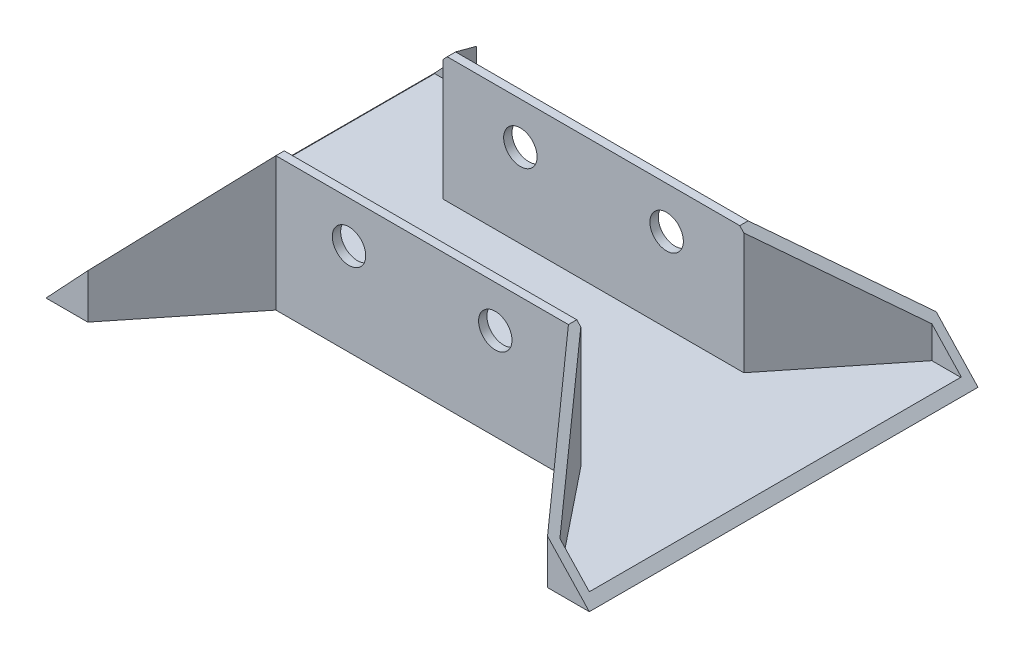
ISO-10303-21;
HEADER;
FILE_DESCRIPTION(('STEP AP214'),'2;1');
FILE_NAME('part.step','',(''),(''),'','','');
FILE_SCHEMA(('AUTOMOTIVE_DESIGN { 1 0 10303 214 1 1 1 1 }'));
ENDSEC;
DATA;
#1=APPLICATION_CONTEXT('core data for automotive mechanical design processes');
#2=APPLICATION_PROTOCOL_DEFINITION('international standard','automotive_design',2000,#1);
#3=PRODUCT_CONTEXT('',#1,'mechanical');
#4=PRODUCT('Part','Part','',(#3));
#5=PRODUCT_RELATED_PRODUCT_CATEGORY('part','',(#4));
#6=PRODUCT_DEFINITION_FORMATION('','',#4);
#7=PRODUCT_DEFINITION_CONTEXT('part definition',#1,'design');
#8=PRODUCT_DEFINITION('design','',#6,#7);
#9=PRODUCT_DEFINITION_SHAPE('','',#8);
#10=(LENGTH_UNIT() NAMED_UNIT(*) SI_UNIT(.MILLI.,.METRE.));
#11=(NAMED_UNIT(*) PLANE_ANGLE_UNIT() SI_UNIT($,.RADIAN.));
#12=(NAMED_UNIT(*) SI_UNIT($,.STERADIAN.) SOLID_ANGLE_UNIT());
#13=UNCERTAINTY_MEASURE_WITH_UNIT(LENGTH_MEASURE(1.E-05),#10,'distance_accuracy_value','');
#14=(GEOMETRIC_REPRESENTATION_CONTEXT(3) GLOBAL_UNCERTAINTY_ASSIGNED_CONTEXT((#13)) GLOBAL_UNIT_ASSIGNED_CONTEXT((#10,
#11,#12)) REPRESENTATION_CONTEXT('',''));
#15=CARTESIAN_POINT('',(0.,0.,0.));
#16=DIRECTION('',(0.,0.,1.));
#17=DIRECTION('',(1.,0.,0.));
#18=AXIS2_PLACEMENT_3D('',#15,#16,#17);
#19=CARTESIAN_POINT('',(35.,32.,46.5));
#20=DIRECTION('',(0.,-1.,0.));
#21=DIRECTION('',(1.,0.,0.));
#22=AXIS2_PLACEMENT_3D('',#19,#20,#21);
#23=PLANE('',#22);
#24=DIRECTION('',(0.,0.,-1.));
#25=VECTOR('',#24,1.);
#26=CARTESIAN_POINT('',(-35.,32.,46.5));
#27=LINE('',#26,#25);
#28=CARTESIAN_POINT('',(-35.,32.,-19.5));
#29=VERTEX_POINT('',#28);
#30=CARTESIAN_POINT('',(-35.,32.,-21.5));
#31=VERTEX_POINT('',#30);
#32=EDGE_CURVE('E303',#29,#31,#27,.T.);
#33=ORIENTED_EDGE('',*,*,#32,.F.);
#34=DIRECTION('',(1.,0.,0.));
#35=VECTOR('',#34,1.);
#36=CARTESIAN_POINT('',(35.,32.,-19.5));
#37=LINE('',#36,#35);
#38=CARTESIAN_POINT('',(35.,32.,-19.5));
#39=VERTEX_POINT('',#38);
#40=EDGE_CURVE('E326',#29,#39,#37,.T.);
#41=ORIENTED_EDGE('',*,*,#40,.T.);
#42=DIRECTION('',(0.,0.,-1.));
#43=VECTOR('',#42,1.);
#44=CARTESIAN_POINT('',(35.,32.,46.5));
#45=LINE('',#44,#43);
#46=CARTESIAN_POINT('',(35.,32.,-21.5));
#47=VERTEX_POINT('',#46);
#48=EDGE_CURVE('E314',#39,#47,#45,.T.);
#49=ORIENTED_EDGE('',*,*,#48,.T.);
#50=DIRECTION('',(1.,0.,0.));
#51=VECTOR('',#50,1.);
#52=CARTESIAN_POINT('',(-35.,32.,-21.5));
#53=LINE('',#52,#51);
#54=EDGE_CURVE('E237',#31,#47,#53,.T.);
#55=ORIENTED_EDGE('',*,*,#54,.F.);
#56=EDGE_LOOP('',(#33,#41,#49,#55));
#57=FACE_BOUND('',#56,.T.);
#58=ADVANCED_FACE('F35',(#57),#23,.F.);
#59=CARTESIAN_POINT('',(0.,0.,46.5));
#60=DIRECTION('',(0.,0.,-1.));
#61=DIRECTION('',(-1.,0.,0.));
#62=AXIS2_PLACEMENT_3D('',#59,#60,#61);
#63=PLANE('',#62);
#64=DIRECTION('',(1.,0.,0.));
#65=VECTOR('',#64,1.);
#66=CARTESIAN_POINT('',(-65.,0.,46.5));
#67=LINE('',#66,#65);
#68=CARTESIAN_POINT('',(-65.,0.,46.5));
#69=VERTEX_POINT('',#68);
#70=CARTESIAN_POINT('',(-55.,0.,46.5));
#71=VERTEX_POINT('',#70);
#72=EDGE_CURVE('E297',#69,#71,#67,.T.);
#73=ORIENTED_EDGE('',*,*,#72,.T.);
#74=DIRECTION('',(0.,1.,0.));
#75=VECTOR('',#74,1.);
#76=CARTESIAN_POINT('',(-55.,0.,46.5));
#77=LINE('',#76,#75);
#78=CARTESIAN_POINT('',(-55.,10.6666666666667,46.5));
#79=VERTEX_POINT('',#78);
#80=EDGE_CURVE('E250',#71,#79,#77,.T.);
#81=ORIENTED_EDGE('',*,*,#80,.T.);
#82=DIRECTION('',(-0.68394112888133,-0.729537204140085,0.));
#83=VECTOR('',#82,1.);
#84=CARTESIAN_POINT('',(-35.,32.,46.5));
#85=LINE('',#84,#83);
#86=EDGE_CURVE('E293',#79,#69,#85,.T.);
#87=ORIENTED_EDGE('',*,*,#86,.T.);
#88=EDGE_LOOP('',(#73,#81,#87));
#89=FACE_BOUND('',#88,.T.);
#90=ADVANCED_FACE('F468',(#89),#63,.F.);
#91=CARTESIAN_POINT('',(0.,0.,-46.5));
#92=DIRECTION('',(0.,0.,-1.));
#93=DIRECTION('',(-1.,0.,0.));
#94=AXIS2_PLACEMENT_3D('',#91,#92,#93);
#95=PLANE('',#94);
#96=DIRECTION('',(0.,1.,0.));
#97=VECTOR('',#96,1.);
#98=CARTESIAN_POINT('',(55.,0.,-46.5));
#99=LINE('',#98,#97);
#100=CARTESIAN_POINT('',(55.,0.,-46.5));
#101=VERTEX_POINT('',#100);
#102=CARTESIAN_POINT('',(55.,10.6666666666667,-46.5));
#103=VERTEX_POINT('',#102);
#104=EDGE_CURVE('E249',#101,#103,#99,.T.);
#105=ORIENTED_EDGE('',*,*,#104,.T.);
#106=DIRECTION('',(-0.68394112888133,0.729537204140085,0.));
#107=VECTOR('',#106,1.);
#108=CARTESIAN_POINT('',(65.,0.,-46.5));
#109=LINE('',#108,#107);
#110=CARTESIAN_POINT('',(65.,0.,-46.5));
#111=VERTEX_POINT('',#110);
#112=EDGE_CURVE('E296',#111,#103,#109,.T.);
#113=ORIENTED_EDGE('',*,*,#112,.F.);
#114=DIRECTION('',(1.,0.,0.));
#115=VECTOR('',#114,1.);
#116=CARTESIAN_POINT('',(-65.,0.,-46.5));
#117=LINE('',#116,#115);
#118=EDGE_CURVE('E305',#101,#111,#117,.T.);
#119=ORIENTED_EDGE('',*,*,#118,.F.);
#120=EDGE_LOOP('',(#105,#113,#119));
#121=FACE_BOUND('',#120,.T.);
#122=ADVANCED_FACE('F487',(#121),#95,.T.);
#123=CARTESIAN_POINT('',(-35.,32.,46.5));
#124=DIRECTION('',(0.729537204140085,-0.68394112888133,0.));
#125=DIRECTION('',(0.68394112888133,0.729537204140085,0.));
#126=AXIS2_PLACEMENT_3D('',#123,#124,#125);
#127=PLANE('',#126);
#128=DIRECTION('',(0.519855731172255,0.554512779917072,0.64981966396532));
#129=VECTOR('',#128,1.);
#130=CARTESIAN_POINT('',(-13.1102792233484,55.349035495095,9.06371308953099));
#131=LINE('',#130,#129);
#132=CARTESIAN_POINT('',(-55.9612496949732,9.64133365869531,-44.5));
#133=VERTEX_POINT('',#132);
#134=CARTESIAN_POINT('',(-35.9612496949732,30.9746669920286,-19.5));
#135=VERTEX_POINT('',#134);
#136=EDGE_CURVE('E12',#133,#135,#131,.T.);
#137=ORIENTED_EDGE('',*,*,#136,.T.);
#138=DIRECTION('',(0.68394112888133,0.729537204140085,0.));
#139=VECTOR('',#138,1.);
#140=CARTESIAN_POINT('',(-35.,32.,-19.5));
#141=LINE('',#140,#139);
#142=EDGE_CURVE('E234',#135,#29,#141,.T.);
#143=ORIENTED_EDGE('',*,*,#142,.T.);
#144=ORIENTED_EDGE('',*,*,#32,.T.);
#145=DIRECTION('',(-0.519855731172255,-0.554512779917072,-0.649819663965319));
#146=VECTOR('',#145,1.);
#147=CARTESIAN_POINT('',(-12.0287515952256,56.5026649650927,7.21406050596806));
#148=LINE('',#147,#146);
#149=CARTESIAN_POINT('',(-55.,10.6666666666666,-46.5));
#150=VERTEX_POINT('',#149);
#151=EDGE_CURVE('E253',#31,#150,#148,.T.);
#152=ORIENTED_EDGE('',*,*,#151,.T.);
#153=DIRECTION('',(-0.68394112888133,-0.729537204140085,0.));
#154=VECTOR('',#153,1.);
#155=CARTESIAN_POINT('',(-35.,32.,-46.5));
#156=LINE('',#155,#154);
#157=CARTESIAN_POINT('',(-65.,0.,-46.5));
#158=VERTEX_POINT('',#157);
#159=EDGE_CURVE('E292',#150,#158,#156,.T.);
#160=ORIENTED_EDGE('',*,*,#159,.T.);
#161=DIRECTION('',(0.,0.,-1.));
#162=VECTOR('',#161,1.);
#163=CARTESIAN_POINT('',(-65.,0.,46.5));
#164=LINE('',#163,#162);
#165=EDGE_CURVE('E321',#69,#158,#164,.T.);
#166=ORIENTED_EDGE('',*,*,#165,.F.);
#167=ORIENTED_EDGE('',*,*,#86,.F.);
#168=DIRECTION('',(0.519855731172255,0.554512779917072,-0.649819663965319));
#169=VECTOR('',#168,1.);
#170=CARTESIAN_POINT('',(-43.44531191352,22.9916672922453,32.0566398919));
#171=LINE('',#170,#169);
#172=CARTESIAN_POINT('',(-35.,32.,21.5));
#173=VERTEX_POINT('',#172);
#174=EDGE_CURVE('E289',#79,#173,#171,.T.);
#175=ORIENTED_EDGE('',*,*,#174,.T.);
#176=CARTESIAN_POINT('',(-35.,32.,19.5));
#177=VERTEX_POINT('',#176);
#178=EDGE_CURVE('E311',#173,#177,#27,.T.);
#179=ORIENTED_EDGE('',*,*,#178,.T.);
#180=DIRECTION('',(-0.68394112888133,-0.729537204140085,0.));
#181=VECTOR('',#180,1.);
#182=CARTESIAN_POINT('',(-35.,32.,19.5));
#183=LINE('',#182,#181);
#184=CARTESIAN_POINT('',(-35.9612496949732,30.9746669920286,19.5));
#185=VERTEX_POINT('',#184);
#186=EDGE_CURVE('E52',#177,#185,#183,.T.);
#187=ORIENTED_EDGE('',*,*,#186,.T.);
#188=DIRECTION('',(-0.519855731172256,-0.554512779917072,0.649819663965319));
#189=VECTOR('',#188,1.);
#190=CARTESIAN_POINT('',(-44.5268395416428,21.8380378222477,30.2069873083371));
#191=LINE('',#190,#189);
#192=CARTESIAN_POINT('',(-55.9612496949732,9.6413336586953,44.5));
#193=VERTEX_POINT('',#192);
#194=EDGE_CURVE('E343',#185,#193,#191,.T.);
#195=ORIENTED_EDGE('',*,*,#194,.T.);
#196=DIRECTION('',(-0.68394112888133,-0.729537204140085,0.));
#197=VECTOR('',#196,1.);
#198=CARTESIAN_POINT('',(-35.,32.,44.5));
#199=LINE('',#198,#197);
#200=CARTESIAN_POINT('',(-63.,2.13333333333335,44.5));
#201=VERTEX_POINT('',#200);
#202=EDGE_CURVE('E346',#193,#201,#199,.T.);
#203=ORIENTED_EDGE('',*,*,#202,.T.);
#204=DIRECTION('',(0.,0.,-1.));
#205=VECTOR('',#204,1.);
#206=CARTESIAN_POINT('',(-63.,2.13333333333333,46.5));
#207=LINE('',#206,#205);
#208=CARTESIAN_POINT('',(-63.,2.1333333333333,-44.5));
#209=VERTEX_POINT('',#208);
#210=EDGE_CURVE('E349',#201,#209,#207,.T.);
#211=ORIENTED_EDGE('',*,*,#210,.T.);
#212=DIRECTION('',(0.68394112888133,0.729537204140085,0.));
#213=VECTOR('',#212,1.);
#214=CARTESIAN_POINT('',(-35.,32.,-44.5));
#215=LINE('',#214,#213);
#216=EDGE_CURVE('E44',#209,#133,#215,.T.);
#217=ORIENTED_EDGE('',*,*,#216,.T.);
#218=EDGE_LOOP('',(#137,#143,#144,#152,#160,#166,#167,#175,#179,#187,#195,#203,#211,#217));
#219=FACE_BOUND('',#218,.T.);
#220=ADVANCED_FACE('F37',(#219),#127,.F.);
#221=CARTESIAN_POINT('',(-65.,0.,46.5));
#222=DIRECTION('',(0.,1.,0.));
#223=DIRECTION('',(-1.,0.,0.));
#224=AXIS2_PLACEMENT_3D('',#221,#222,#223);
#225=PLANE('',#224);
#226=DIRECTION('',(-1.,0.,0.));
#227=VECTOR('',#226,1.);
#228=CARTESIAN_POINT('',(-35.,0.,21.5));
#229=LINE('',#228,#227);
#230=CARTESIAN_POINT('',(35.,0.,21.5));
#231=VERTEX_POINT('',#230);
#232=CARTESIAN_POINT('',(-35.,0.,21.5));
#233=VERTEX_POINT('',#232);
#234=EDGE_CURVE('E239',#231,#233,#229,.T.);
#235=ORIENTED_EDGE('',*,*,#234,.T.);
#236=DIRECTION('',(-0.624695047554425,0.,0.78086880944303));
#237=VECTOR('',#236,1.);
#238=CARTESIAN_POINT('',(-55.,0.,46.5));
#239=LINE('',#238,#237);
#240=EDGE_CURVE('E243',#233,#71,#239,.T.);
#241=ORIENTED_EDGE('',*,*,#240,.T.);
#242=ORIENTED_EDGE('',*,*,#72,.F.);
#243=ORIENTED_EDGE('',*,*,#165,.T.);
#244=CARTESIAN_POINT('',(-55.,0.,-46.5));
#245=VERTEX_POINT('',#244);
#246=EDGE_CURVE('E306',#158,#245,#117,.T.);
#247=ORIENTED_EDGE('',*,*,#246,.T.);
#248=DIRECTION('',(0.624695047554424,0.,0.78086880944303));
#249=VECTOR('',#248,1.);
#250=CARTESIAN_POINT('',(-55.,0.,-46.5));
#251=LINE('',#250,#249);
#252=CARTESIAN_POINT('',(-35.,0.,-21.5));
#253=VERTEX_POINT('',#252);
#254=EDGE_CURVE('E260',#245,#253,#251,.T.);
#255=ORIENTED_EDGE('',*,*,#254,.T.);
#256=DIRECTION('',(1.,0.,0.));
#257=VECTOR('',#256,1.);
#258=CARTESIAN_POINT('',(-35.,0.,-21.5));
#259=LINE('',#258,#257);
#260=CARTESIAN_POINT('',(35.,0.,-21.5));
#261=VERTEX_POINT('',#260);
#262=EDGE_CURVE('E263',#253,#261,#259,.T.);
#263=ORIENTED_EDGE('',*,*,#262,.T.);
#264=DIRECTION('',(0.624695047554424,0.,-0.780868809443031));
#265=VECTOR('',#264,1.);
#266=CARTESIAN_POINT('',(35.,0.,-21.5));
#267=LINE('',#266,#265);
#268=EDGE_CURVE('E266',#261,#101,#267,.T.);
#269=ORIENTED_EDGE('',*,*,#268,.T.);
#270=ORIENTED_EDGE('',*,*,#118,.T.);
#271=DIRECTION('',(0.,0.,-1.));
#272=VECTOR('',#271,1.);
#273=CARTESIAN_POINT('',(65.,0.,46.5));
#274=LINE('',#273,#272);
#275=CARTESIAN_POINT('',(65.,0.,46.5));
#276=VERTEX_POINT('',#275);
#277=EDGE_CURVE('E318',#276,#111,#274,.T.);
#278=ORIENTED_EDGE('',*,*,#277,.F.);
#279=CARTESIAN_POINT('',(55.,0.,46.5));
#280=VERTEX_POINT('',#279);
#281=EDGE_CURVE('E295',#280,#276,#67,.T.);
#282=ORIENTED_EDGE('',*,*,#281,.F.);
#283=DIRECTION('',(-0.624695047554424,0.,-0.78086880944303));
#284=VECTOR('',#283,1.);
#285=CARTESIAN_POINT('',(35.,0.,21.5));
#286=LINE('',#285,#284);
#287=EDGE_CURVE('E60',#280,#231,#286,.T.);
#288=ORIENTED_EDGE('',*,*,#287,.T.);
#289=EDGE_LOOP('',(#235,#241,#242,#243,#247,#255,#263,#269,#270,#278,#282,#288));
#290=FACE_BOUND('',#289,.T.);
#291=ADVANCED_FACE('F464',(#290),#225,.F.);
#292=CARTESIAN_POINT('',(65.,0.,46.5));
#293=DIRECTION('',(-0.729537204140085,-0.68394112888133,0.));
#294=DIRECTION('',(0.68394112888133,-0.729537204140085,0.));
#295=AXIS2_PLACEMENT_3D('',#292,#293,#294);
#296=PLANE('',#295);
#297=ORIENTED_EDGE('',*,*,#48,.F.);
#298=DIRECTION('',(0.68394112888133,-0.729537204140085,0.));
#299=VECTOR('',#298,1.);
#300=CARTESIAN_POINT('',(65.,0.,-19.5));
#301=LINE('',#300,#299);
#302=CARTESIAN_POINT('',(35.9612496949731,30.9746669920286,-19.5));
#303=VERTEX_POINT('',#302);
#304=EDGE_CURVE('E231',#39,#303,#301,.T.);
#305=ORIENTED_EDGE('',*,*,#304,.T.);
#306=DIRECTION('',(0.519855731172255,-0.554512779917072,-0.64981966396532));
#307=VECTOR('',#306,1.);
#308=CARTESIAN_POINT('',(30.4423113530684,36.8615345567271,-12.601327072619));
#309=LINE('',#308,#307);
#310=CARTESIAN_POINT('',(55.9612496949731,9.64133365869531,-44.5));
#311=VERTEX_POINT('',#310);
#312=EDGE_CURVE('E340',#303,#311,#309,.T.);
#313=ORIENTED_EDGE('',*,*,#312,.T.);
#314=DIRECTION('',(0.68394112888133,-0.729537204140085,0.));
#315=VECTOR('',#314,1.);
#316=CARTESIAN_POINT('',(65.,0.,-44.5));
#317=LINE('',#316,#315);
#318=CARTESIAN_POINT('',(63.,2.13333333333335,-44.5));
#319=VERTEX_POINT('',#318);
#320=EDGE_CURVE('E337',#311,#319,#317,.T.);
#321=ORIENTED_EDGE('',*,*,#320,.T.);
#322=DIRECTION('',(0.,0.,1.));
#323=VECTOR('',#322,1.);
#324=CARTESIAN_POINT('',(63.,2.13333333333336,46.5));
#325=LINE('',#324,#323);
#326=CARTESIAN_POINT('',(63.,2.13333333333333,44.5));
#327=VERTEX_POINT('',#326);
#328=EDGE_CURVE('E334',#319,#327,#325,.T.);
#329=ORIENTED_EDGE('',*,*,#328,.T.);
#330=DIRECTION('',(-0.68394112888133,0.729537204140085,0.));
#331=VECTOR('',#330,1.);
#332=CARTESIAN_POINT('',(65.,0.,44.5));
#333=LINE('',#332,#331);
#334=CARTESIAN_POINT('',(55.9612496949731,9.64133365869536,44.5));
#335=VERTEX_POINT('',#334);
#336=EDGE_CURVE('E331',#327,#335,#333,.T.);
#337=ORIENTED_EDGE('',*,*,#336,.T.);
#338=DIRECTION('',(-0.519855731172255,0.554512779917072,-0.649819663965319));
#339=VECTOR('',#338,1.);
#340=CARTESIAN_POINT('',(61.8588716713628,3.3505368838797,51.8720274704871));
#341=LINE('',#340,#339);
#342=CARTESIAN_POINT('',(35.9612496949731,30.9746669920286,19.5));
#343=VERTEX_POINT('',#342);
#344=EDGE_CURVE('E329',#335,#343,#341,.T.);
#345=ORIENTED_EDGE('',*,*,#344,.T.);
#346=DIRECTION('',(-0.68394112888133,0.729537204140085,0.));
#347=VECTOR('',#346,1.);
#348=CARTESIAN_POINT('',(65.,0.,19.5));
#349=LINE('',#348,#347);
#350=CARTESIAN_POINT('',(35.,32.,19.5));
#351=VERTEX_POINT('',#350);
#352=EDGE_CURVE('E217',#343,#351,#349,.T.);
#353=ORIENTED_EDGE('',*,*,#352,.T.);
#354=CARTESIAN_POINT('',(35.,32.,21.5));
#355=VERTEX_POINT('',#354);
#356=EDGE_CURVE('E315',#355,#351,#45,.T.);
#357=ORIENTED_EDGE('',*,*,#356,.F.);
#358=DIRECTION('',(0.519855731172255,-0.554512779917072,0.649819663965319));
#359=VECTOR('',#358,1.);
#360=CARTESIAN_POINT('',(60.77734404324,4.50416635387736,53.72168005405));
#361=LINE('',#360,#359);
#362=CARTESIAN_POINT('',(55.,10.6666666666667,46.5));
#363=VERTEX_POINT('',#362);
#364=EDGE_CURVE('E286',#355,#363,#361,.T.);
#365=ORIENTED_EDGE('',*,*,#364,.T.);
#366=DIRECTION('',(-0.68394112888133,0.729537204140085,0.));
#367=VECTOR('',#366,1.);
#368=CARTESIAN_POINT('',(65.,0.,46.5));
#369=LINE('',#368,#367);
#370=EDGE_CURVE('E300',#276,#363,#369,.T.);
#371=ORIENTED_EDGE('',*,*,#370,.F.);
#372=ORIENTED_EDGE('',*,*,#277,.T.);
#373=ORIENTED_EDGE('',*,*,#112,.T.);
#374=DIRECTION('',(-0.519855731172255,0.554512779917072,0.64981966396532));
#375=VECTOR('',#374,1.);
#376=CARTESIAN_POINT('',(29.3607837249455,38.0151640267248,-14.4509796561819));
#377=LINE('',#376,#375);
#378=EDGE_CURVE('E283',#103,#47,#377,.T.);
#379=ORIENTED_EDGE('',*,*,#378,.T.);
#380=EDGE_LOOP('',(#297,#305,#313,#321,#329,#337,#345,#353,#357,#365,#371,#372,#373,#379));
#381=FACE_BOUND('',#380,.T.);
#382=ADVANCED_FACE('F425',(#381),#296,.F.);
#383=ORIENTED_EDGE('',*,*,#356,.T.);
#384=DIRECTION('',(-1.,0.,0.));
#385=VECTOR('',#384,1.);
#386=CARTESIAN_POINT('',(35.,32.,19.5));
#387=LINE('',#386,#385);
#388=EDGE_CURVE('E324',#351,#177,#387,.T.);
#389=ORIENTED_EDGE('',*,*,#388,.T.);
#390=ORIENTED_EDGE('',*,*,#178,.F.);
#391=DIRECTION('',(-1.,0.,0.));
#392=VECTOR('',#391,1.);
#393=CARTESIAN_POINT('',(-35.,32.,21.5));
#394=LINE('',#393,#392);
#395=EDGE_CURVE('E240',#355,#173,#394,.T.);
#396=ORIENTED_EDGE('',*,*,#395,.F.);
#397=EDGE_LOOP('',(#383,#389,#390,#396));
#398=FACE_BOUND('',#397,.T.);
#399=ADVANCED_FACE('F479',(#398),#23,.F.);
#400=ORIENTED_EDGE('',*,*,#370,.T.);
#401=DIRECTION('',(0.,1.,0.));
#402=VECTOR('',#401,1.);
#403=CARTESIAN_POINT('',(55.,0.,46.5));
#404=LINE('',#403,#402);
#405=EDGE_CURVE('E246',#280,#363,#404,.T.);
#406=ORIENTED_EDGE('',*,*,#405,.F.);
#407=ORIENTED_EDGE('',*,*,#281,.T.);
#408=EDGE_LOOP('',(#400,#406,#407));
#409=FACE_BOUND('',#408,.T.);
#410=ADVANCED_FACE('F482',(#409),#63,.F.);
#411=DIRECTION('',(0.,1.,0.));
#412=VECTOR('',#411,1.);
#413=CARTESIAN_POINT('',(-55.,0.,-46.5));
#414=LINE('',#413,#412);
#415=EDGE_CURVE('E269',#245,#150,#414,.T.);
#416=ORIENTED_EDGE('',*,*,#415,.F.);
#417=ORIENTED_EDGE('',*,*,#246,.F.);
#418=ORIENTED_EDGE('',*,*,#159,.F.);
#419=EDGE_LOOP('',(#416,#417,#418));
#420=FACE_BOUND('',#419,.T.);
#421=ADVANCED_FACE('F461',(#420),#95,.T.);
#422=CARTESIAN_POINT('',(35.,0.,-21.5));
#423=DIRECTION('',(0.780868809443031,0.,0.624695047554424));
#424=DIRECTION('',(0.624695047554424,0.,-0.780868809443031));
#425=AXIS2_PLACEMENT_3D('',#422,#423,#424);
#426=PLANE('',#425);
#427=ORIENTED_EDGE('',*,*,#104,.F.);
#428=ORIENTED_EDGE('',*,*,#268,.F.);
#429=DIRECTION('',(0.,1.,0.));
#430=VECTOR('',#429,1.);
#431=CARTESIAN_POINT('',(35.,0.,-21.5));
#432=LINE('',#431,#430);
#433=EDGE_CURVE('E274',#261,#47,#432,.T.);
#434=ORIENTED_EDGE('',*,*,#433,.T.);
#435=ORIENTED_EDGE('',*,*,#378,.F.);
#436=EDGE_LOOP('',(#427,#428,#434,#435));
#437=FACE_BOUND('',#436,.T.);
#438=ADVANCED_FACE('F448',(#437),#426,.F.);
#439=CARTESIAN_POINT('',(-55.,0.,-46.5));
#440=DIRECTION('',(-0.780868809443031,0.,0.624695047554424));
#441=DIRECTION('',(0.624695047554424,0.,0.78086880944303));
#442=AXIS2_PLACEMENT_3D('',#439,#440,#441);
#443=PLANE('',#442);
#444=DIRECTION('',(0.,1.,0.));
#445=VECTOR('',#444,1.);
#446=CARTESIAN_POINT('',(-35.,0.,-21.5));
#447=LINE('',#446,#445);
#448=EDGE_CURVE('E277',#253,#31,#447,.T.);
#449=ORIENTED_EDGE('',*,*,#448,.F.);
#450=ORIENTED_EDGE('',*,*,#254,.F.);
#451=ORIENTED_EDGE('',*,*,#415,.T.);
#452=ORIENTED_EDGE('',*,*,#151,.F.);
#453=EDGE_LOOP('',(#449,#450,#451,#452));
#454=FACE_BOUND('',#453,.T.);
#455=ADVANCED_FACE('F454',(#454),#443,.F.);
#456=CARTESIAN_POINT('',(-35.,0.,-21.5));
#457=DIRECTION('',(0.,0.,1.));
#458=DIRECTION('',(1.,0.,0.));
#459=AXIS2_PLACEMENT_3D('',#456,#457,#458);
#460=PLANE('',#459);
#461=CARTESIAN_POINT('',(-17.5,22.,-21.5));
#462=DIRECTION('',(0.,0.,1.));
#463=DIRECTION('',(1.,0.,0.));
#464=AXIS2_PLACEMENT_3D('',#461,#462,#463);
#465=CIRCLE('',#464,4.);
#466=CARTESIAN_POINT('',(-13.5,22.,-21.5));
#467=VERTEX_POINT('',#466);
#468=EDGE_CURVE('E375',#467,#467,#465,.T.);
#469=ORIENTED_EDGE('',*,*,#468,.T.);
#470=EDGE_LOOP('',(#469));
#471=FACE_BOUND('',#470,.T.);
#472=CARTESIAN_POINT('',(17.5,22.,-21.5));
#473=DIRECTION('',(0.,0.,1.));
#474=DIRECTION('',(1.,0.,0.));
#475=AXIS2_PLACEMENT_3D('',#472,#473,#474);
#476=CIRCLE('',#475,4.);
#477=CARTESIAN_POINT('',(21.5,22.,-21.5));
#478=VERTEX_POINT('',#477);
#479=EDGE_CURVE('E360',#478,#478,#476,.T.);
#480=ORIENTED_EDGE('',*,*,#479,.T.);
#481=EDGE_LOOP('',(#480));
#482=FACE_BOUND('',#481,.T.);
#483=ORIENTED_EDGE('',*,*,#54,.T.);
#484=ORIENTED_EDGE('',*,*,#433,.F.);
#485=ORIENTED_EDGE('',*,*,#262,.F.);
#486=ORIENTED_EDGE('',*,*,#448,.T.);
#487=EDGE_LOOP('',(#483,#484,#485,#486));
#488=FACE_BOUND('',#487,.T.);
#489=ADVANCED_FACE('F451',(#471,#482,#488),#460,.F.);
#490=CARTESIAN_POINT('',(-55.,0.,46.5));
#491=DIRECTION('',(-0.78086880944303,0.,-0.624695047554425));
#492=DIRECTION('',(-0.624695047554425,0.,0.78086880944303));
#493=AXIS2_PLACEMENT_3D('',#490,#491,#492);
#494=PLANE('',#493);
#495=ORIENTED_EDGE('',*,*,#80,.F.);
#496=ORIENTED_EDGE('',*,*,#240,.F.);
#497=DIRECTION('',(0.,1.,0.));
#498=VECTOR('',#497,1.);
#499=CARTESIAN_POINT('',(-35.,0.,21.5));
#500=LINE('',#499,#498);
#501=EDGE_CURVE('E254',#233,#173,#500,.T.);
#502=ORIENTED_EDGE('',*,*,#501,.T.);
#503=ORIENTED_EDGE('',*,*,#174,.F.);
#504=EDGE_LOOP('',(#495,#496,#502,#503));
#505=FACE_BOUND('',#504,.T.);
#506=ADVANCED_FACE('F471',(#505),#494,.F.);
#507=CARTESIAN_POINT('',(35.,0.,21.5));
#508=DIRECTION('',(0.78086880944303,0.,-0.624695047554424));
#509=DIRECTION('',(-0.624695047554424,0.,-0.78086880944303));
#510=AXIS2_PLACEMENT_3D('',#507,#508,#509);
#511=PLANE('',#510);
#512=DIRECTION('',(0.,1.,0.));
#513=VECTOR('',#512,1.);
#514=CARTESIAN_POINT('',(35.,0.,21.5));
#515=LINE('',#514,#513);
#516=EDGE_CURVE('E256',#231,#355,#515,.T.);
#517=ORIENTED_EDGE('',*,*,#516,.F.);
#518=ORIENTED_EDGE('',*,*,#287,.F.);
#519=ORIENTED_EDGE('',*,*,#405,.T.);
#520=ORIENTED_EDGE('',*,*,#364,.F.);
#521=EDGE_LOOP('',(#517,#518,#519,#520));
#522=FACE_BOUND('',#521,.T.);
#523=ADVANCED_FACE('F655',(#522),#511,.F.);
#524=CARTESIAN_POINT('',(-35.,0.,21.5));
#525=DIRECTION('',(0.,0.,-1.));
#526=DIRECTION('',(-1.,0.,0.));
#527=AXIS2_PLACEMENT_3D('',#524,#525,#526);
#528=PLANE('',#527);
#529=CARTESIAN_POINT('',(-17.5,22.,21.5));
#530=DIRECTION('',(0.,0.,1.));
#531=DIRECTION('',(1.,0.,0.));
#532=AXIS2_PLACEMENT_3D('',#529,#530,#531);
#533=CIRCLE('',#532,4.);
#534=CARTESIAN_POINT('',(-13.5,22.,21.5));
#535=VERTEX_POINT('',#534);
#536=EDGE_CURVE('E356',#535,#535,#533,.T.);
#537=ORIENTED_EDGE('',*,*,#536,.F.);
#538=EDGE_LOOP('',(#537));
#539=FACE_BOUND('',#538,.T.);
#540=CARTESIAN_POINT('',(17.5,22.,21.5));
#541=DIRECTION('',(0.,0.,1.));
#542=DIRECTION('',(1.,0.,0.));
#543=AXIS2_PLACEMENT_3D('',#540,#541,#542);
#544=CIRCLE('',#543,4.);
#545=CARTESIAN_POINT('',(21.5,22.,21.5));
#546=VERTEX_POINT('',#545);
#547=EDGE_CURVE('E363',#546,#546,#544,.T.);
#548=ORIENTED_EDGE('',*,*,#547,.F.);
#549=EDGE_LOOP('',(#548));
#550=FACE_BOUND('',#549,.T.);
#551=ORIENTED_EDGE('',*,*,#395,.T.);
#552=ORIENTED_EDGE('',*,*,#501,.F.);
#553=ORIENTED_EDGE('',*,*,#234,.F.);
#554=ORIENTED_EDGE('',*,*,#516,.T.);
#555=EDGE_LOOP('',(#551,#552,#553,#554));
#556=FACE_BOUND('',#555,.T.);
#557=ADVANCED_FACE('F475',(#539,#550,#556),#528,.F.);
#558=CARTESIAN_POINT('',(-55.9612496949731,-154.262762843144,44.5));
#559=DIRECTION('',(0.78086880944303,0.,0.624695047554425));
#560=DIRECTION('',(0.624695047554425,0.,-0.78086880944303));
#561=AXIS2_PLACEMENT_3D('',#558,#559,#560);
#562=PLANE('',#561);
#563=DIRECTION('',(0.,1.,0.));
#564=VECTOR('',#563,1.);
#565=CARTESIAN_POINT('',(-35.9612496949731,-154.262762843144,19.5));
#566=LINE('',#565,#564);
#567=CARTESIAN_POINT('',(-35.9612496949731,2.,19.5));
#568=VERTEX_POINT('',#567);
#569=EDGE_CURVE('E218',#568,#185,#566,.T.);
#570=ORIENTED_EDGE('',*,*,#569,.F.);
#571=DIRECTION('',(-0.624695047554425,0.,0.78086880944303));
#572=VECTOR('',#571,1.);
#573=CARTESIAN_POINT('',(-55.9612496949732,2.,44.5));
#574=LINE('',#573,#572);
#575=CARTESIAN_POINT('',(-55.9612496949731,2.,44.5));
#576=VERTEX_POINT('',#575);
#577=EDGE_CURVE('E222',#568,#576,#574,.T.);
#578=ORIENTED_EDGE('',*,*,#577,.T.);
#579=DIRECTION('',(0.,1.,0.));
#580=VECTOR('',#579,1.);
#581=CARTESIAN_POINT('',(-55.9612496949731,-154.262762843144,44.5));
#582=LINE('',#581,#580);
#583=EDGE_CURVE('E211',#576,#193,#582,.T.);
#584=ORIENTED_EDGE('',*,*,#583,.T.);
#585=ORIENTED_EDGE('',*,*,#194,.F.);
#586=EDGE_LOOP('',(#570,#578,#584,#585));
#587=FACE_BOUND('',#586,.T.);
#588=ADVANCED_FACE('F533',(#587),#562,.F.);
#589=CARTESIAN_POINT('',(-63.,-154.262762843144,44.5));
#590=DIRECTION('',(0.,0.,1.));
#591=DIRECTION('',(1.,0.,0.));
#592=AXIS2_PLACEMENT_3D('',#589,#590,#591);
#593=PLANE('',#592);
#594=ORIENTED_EDGE('',*,*,#583,.F.);
#595=DIRECTION('',(-1.,0.,0.));
#596=VECTOR('',#595,1.);
#597=CARTESIAN_POINT('',(-63.,2.,44.5));
#598=LINE('',#597,#596);
#599=CARTESIAN_POINT('',(-63.,2.,44.5));
#600=VERTEX_POINT('',#599);
#601=EDGE_CURVE('E226',#576,#600,#598,.T.);
#602=ORIENTED_EDGE('',*,*,#601,.T.);
#603=DIRECTION('',(0.,1.,0.));
#604=VECTOR('',#603,1.);
#605=CARTESIAN_POINT('',(-63.,-154.262762843144,44.5));
#606=LINE('',#605,#604);
#607=EDGE_CURVE('E396',#600,#201,#606,.T.);
#608=ORIENTED_EDGE('',*,*,#607,.T.);
#609=ORIENTED_EDGE('',*,*,#202,.F.);
#610=EDGE_LOOP('',(#594,#602,#608,#609));
#611=FACE_BOUND('',#610,.T.);
#612=ADVANCED_FACE('F538',(#611),#593,.F.);
#613=CARTESIAN_POINT('',(-63.,-154.262762843144,-44.5));
#614=DIRECTION('',(-1.,0.,0.));
#615=DIRECTION('',(0.,-1.,0.));
#616=AXIS2_PLACEMENT_3D('',#613,#614,#615);
#617=PLANE('',#616);
#618=ORIENTED_EDGE('',*,*,#607,.F.);
#619=DIRECTION('',(0.,0.,-1.));
#620=VECTOR('',#619,1.);
#621=CARTESIAN_POINT('',(-63.,2.,-44.5));
#622=LINE('',#621,#620);
#623=CARTESIAN_POINT('',(-63.,2.,-44.5));
#624=VERTEX_POINT('',#623);
#625=EDGE_CURVE('E391',#600,#624,#622,.T.);
#626=ORIENTED_EDGE('',*,*,#625,.T.);
#627=DIRECTION('',(0.,1.,0.));
#628=VECTOR('',#627,1.);
#629=CARTESIAN_POINT('',(-63.,-154.262762843144,-44.5));
#630=LINE('',#629,#628);
#631=EDGE_CURVE('E399',#624,#209,#630,.T.);
#632=ORIENTED_EDGE('',*,*,#631,.T.);
#633=ORIENTED_EDGE('',*,*,#210,.F.);
#634=EDGE_LOOP('',(#618,#626,#632,#633));
#635=FACE_BOUND('',#634,.T.);
#636=ADVANCED_FACE('F549',(#635),#617,.F.);
#637=CARTESIAN_POINT('',(-55.9612496949731,-154.262762843144,-44.5));
#638=DIRECTION('',(0.,0.,-1.));
#639=DIRECTION('',(-1.,0.,0.));
#640=AXIS2_PLACEMENT_3D('',#637,#638,#639);
#641=PLANE('',#640);
#642=ORIENTED_EDGE('',*,*,#631,.F.);
#643=DIRECTION('',(1.,0.,0.));
#644=VECTOR('',#643,1.);
#645=CARTESIAN_POINT('',(-55.9612496949732,2.,-44.5));
#646=LINE('',#645,#644);
#647=CARTESIAN_POINT('',(-55.9612496949731,2.,-44.5));
#648=VERTEX_POINT('',#647);
#649=EDGE_CURVE('E389',#624,#648,#646,.T.);
#650=ORIENTED_EDGE('',*,*,#649,.T.);
#651=DIRECTION('',(0.,1.,0.));
#652=VECTOR('',#651,1.);
#653=CARTESIAN_POINT('',(-55.9612496949731,-154.262762843144,-44.5));
#654=LINE('',#653,#652);
#655=EDGE_CURVE('E402',#648,#133,#654,.T.);
#656=ORIENTED_EDGE('',*,*,#655,.T.);
#657=ORIENTED_EDGE('',*,*,#216,.F.);
#658=EDGE_LOOP('',(#642,#650,#656,#657));
#659=FACE_BOUND('',#658,.T.);
#660=ADVANCED_FACE('F559',(#659),#641,.F.);
#661=CARTESIAN_POINT('',(-35.9612496949731,-154.262762843144,-19.5));
#662=DIRECTION('',(0.780868809443031,0.,-0.624695047554424));
#663=DIRECTION('',(-0.624695047554424,0.,-0.780868809443031));
#664=AXIS2_PLACEMENT_3D('',#661,#662,#663);
#665=PLANE('',#664);
#666=ORIENTED_EDGE('',*,*,#655,.F.);
#667=DIRECTION('',(0.624695047554424,0.,0.78086880944303));
#668=VECTOR('',#667,1.);
#669=CARTESIAN_POINT('',(-35.9612496949732,2.,-19.5));
#670=LINE('',#669,#668);
#671=CARTESIAN_POINT('',(-35.9612496949732,2.00000000000002,-19.5));
#672=VERTEX_POINT('',#671);
#673=EDGE_CURVE('E387',#648,#672,#670,.T.);
#674=ORIENTED_EDGE('',*,*,#673,.T.);
#675=DIRECTION('',(0.,1.,0.));
#676=VECTOR('',#675,1.);
#677=CARTESIAN_POINT('',(-35.9612496949731,-154.262762843144,-19.5));
#678=LINE('',#677,#676);
#679=EDGE_CURVE('E405',#672,#135,#678,.T.);
#680=ORIENTED_EDGE('',*,*,#679,.T.);
#681=ORIENTED_EDGE('',*,*,#136,.F.);
#682=EDGE_LOOP('',(#666,#674,#680,#681));
#683=FACE_BOUND('',#682,.T.);
#684=ADVANCED_FACE('F569',(#683),#665,.F.);
#685=CARTESIAN_POINT('',(55.9612496949731,-154.262762843144,-44.5));
#686=DIRECTION('',(-0.780868809443031,0.,-0.624695047554424));
#687=DIRECTION('',(-0.624695047554424,0.,0.780868809443031));
#688=AXIS2_PLACEMENT_3D('',#685,#686,#687);
#689=PLANE('',#688);
#690=DIRECTION('',(0.,1.,0.));
#691=VECTOR('',#690,1.);
#692=CARTESIAN_POINT('',(35.9612496949732,-154.262762843144,-19.5));
#693=LINE('',#692,#691);
#694=CARTESIAN_POINT('',(35.9612496949731,2.00000000000003,-19.5));
#695=VERTEX_POINT('',#694);
#696=EDGE_CURVE('E408',#695,#303,#693,.T.);
#697=ORIENTED_EDGE('',*,*,#696,.F.);
#698=DIRECTION('',(0.624695047554424,0.,-0.780868809443031));
#699=VECTOR('',#698,1.);
#700=CARTESIAN_POINT('',(55.9612496949731,2.00000000000003,-44.5));
#701=LINE('',#700,#699);
#702=CARTESIAN_POINT('',(55.9612496949731,2.00000000000003,-44.5));
#703=VERTEX_POINT('',#702);
#704=EDGE_CURVE('E383',#695,#703,#701,.T.);
#705=ORIENTED_EDGE('',*,*,#704,.T.);
#706=DIRECTION('',(0.,1.,0.));
#707=VECTOR('',#706,1.);
#708=CARTESIAN_POINT('',(55.9612496949731,-154.262762843144,-44.5));
#709=LINE('',#708,#707);
#710=EDGE_CURVE('E411',#703,#311,#709,.T.);
#711=ORIENTED_EDGE('',*,*,#710,.T.);
#712=ORIENTED_EDGE('',*,*,#312,.F.);
#713=EDGE_LOOP('',(#697,#705,#711,#712));
#714=FACE_BOUND('',#713,.T.);
#715=ADVANCED_FACE('F440',(#714),#689,.F.);
#716=CARTESIAN_POINT('',(63.,-154.262762843144,-44.5));
#717=DIRECTION('',(0.,0.,-1.));
#718=DIRECTION('',(-1.,0.,0.));
#719=AXIS2_PLACEMENT_3D('',#716,#717,#718);
#720=PLANE('',#719);
#721=ORIENTED_EDGE('',*,*,#710,.F.);
#722=DIRECTION('',(1.,0.,0.));
#723=VECTOR('',#722,1.);
#724=CARTESIAN_POINT('',(63.,2.00000000000003,-44.5));
#725=LINE('',#724,#723);
#726=CARTESIAN_POINT('',(63.,2.00000000000003,-44.5));
#727=VERTEX_POINT('',#726);
#728=EDGE_CURVE('E381',#703,#727,#725,.T.);
#729=ORIENTED_EDGE('',*,*,#728,.T.);
#730=DIRECTION('',(0.,1.,0.));
#731=VECTOR('',#730,1.);
#732=CARTESIAN_POINT('',(63.,-154.262762843144,-44.5));
#733=LINE('',#732,#731);
#734=EDGE_CURVE('E414',#727,#319,#733,.T.);
#735=ORIENTED_EDGE('',*,*,#734,.T.);
#736=ORIENTED_EDGE('',*,*,#320,.F.);
#737=EDGE_LOOP('',(#721,#729,#735,#736));
#738=FACE_BOUND('',#737,.T.);
#739=ADVANCED_FACE('F431',(#738),#720,.F.);
#740=CARTESIAN_POINT('',(63.,-154.262762843144,44.5));
#741=DIRECTION('',(1.,0.,0.));
#742=DIRECTION('',(0.,1.,0.));
#743=AXIS2_PLACEMENT_3D('',#740,#741,#742);
#744=PLANE('',#743);
#745=ORIENTED_EDGE('',*,*,#734,.F.);
#746=DIRECTION('',(0.,0.,1.));
#747=VECTOR('',#746,1.);
#748=CARTESIAN_POINT('',(63.,2.00000000000003,44.5));
#749=LINE('',#748,#747);
#750=CARTESIAN_POINT('',(63.,2.00000000000003,44.5));
#751=VERTEX_POINT('',#750);
#752=EDGE_CURVE('E379',#727,#751,#749,.T.);
#753=ORIENTED_EDGE('',*,*,#752,.T.);
#754=DIRECTION('',(0.,1.,0.));
#755=VECTOR('',#754,1.);
#756=CARTESIAN_POINT('',(63.,-154.262762843144,44.5));
#757=LINE('',#756,#755);
#758=EDGE_CURVE('E417',#751,#327,#757,.T.);
#759=ORIENTED_EDGE('',*,*,#758,.T.);
#760=ORIENTED_EDGE('',*,*,#328,.F.);
#761=EDGE_LOOP('',(#745,#753,#759,#760));
#762=FACE_BOUND('',#761,.T.);
#763=ADVANCED_FACE('F428',(#762),#744,.F.);
#764=CARTESIAN_POINT('',(55.9612496949731,-154.262762843144,44.5));
#765=DIRECTION('',(0.,0.,1.));
#766=DIRECTION('',(1.,0.,0.));
#767=AXIS2_PLACEMENT_3D('',#764,#765,#766);
#768=PLANE('',#767);
#769=ORIENTED_EDGE('',*,*,#758,.F.);
#770=DIRECTION('',(-1.,0.,0.));
#771=VECTOR('',#770,1.);
#772=CARTESIAN_POINT('',(55.9612496949731,2.00000000000003,44.5));
#773=LINE('',#772,#771);
#774=CARTESIAN_POINT('',(55.9612496949731,2.00000000000003,44.5));
#775=VERTEX_POINT('',#774);
#776=EDGE_CURVE('E210',#751,#775,#773,.T.);
#777=ORIENTED_EDGE('',*,*,#776,.T.);
#778=DIRECTION('',(0.,1.,0.));
#779=VECTOR('',#778,1.);
#780=CARTESIAN_POINT('',(55.9612496949731,-154.262762843144,44.5));
#781=LINE('',#780,#779);
#782=EDGE_CURVE('E206',#775,#335,#781,.T.);
#783=ORIENTED_EDGE('',*,*,#782,.T.);
#784=ORIENTED_EDGE('',*,*,#336,.F.);
#785=EDGE_LOOP('',(#769,#777,#783,#784));
#786=FACE_BOUND('',#785,.T.);
#787=ADVANCED_FACE('F422',(#786),#768,.F.);
#788=CARTESIAN_POINT('',(35.9612496949732,-154.262762843144,19.5));
#789=DIRECTION('',(-0.78086880944303,0.,0.624695047554424));
#790=DIRECTION('',(0.624695047554424,0.,0.78086880944303));
#791=AXIS2_PLACEMENT_3D('',#788,#789,#790);
#792=PLANE('',#791);
#793=ORIENTED_EDGE('',*,*,#782,.F.);
#794=DIRECTION('',(-0.624695047554424,0.,-0.780868809443031));
#795=VECTOR('',#794,1.);
#796=CARTESIAN_POINT('',(35.9612496949731,2.00000000000003,19.5));
#797=LINE('',#796,#795);
#798=CARTESIAN_POINT('',(35.9612496949731,2.,19.5));
#799=VERTEX_POINT('',#798);
#800=EDGE_CURVE('E200',#775,#799,#797,.T.);
#801=ORIENTED_EDGE('',*,*,#800,.T.);
#802=DIRECTION('',(0.,1.,0.));
#803=VECTOR('',#802,1.);
#804=CARTESIAN_POINT('',(35.9612496949732,-154.262762843144,19.5));
#805=LINE('',#804,#803);
#806=EDGE_CURVE('E203',#799,#343,#805,.T.);
#807=ORIENTED_EDGE('',*,*,#806,.T.);
#808=ORIENTED_EDGE('',*,*,#344,.F.);
#809=EDGE_LOOP('',(#793,#801,#807,#808));
#810=FACE_BOUND('',#809,.T.);
#811=ADVANCED_FACE('F202',(#810),#792,.F.);
#812=CARTESIAN_POINT('',(35.9612496949732,-154.262762843144,-19.5));
#813=DIRECTION('',(0.,0.,-1.));
#814=DIRECTION('',(-1.,0.,0.));
#815=AXIS2_PLACEMENT_3D('',#812,#813,#814);
#816=PLANE('',#815);
#817=CARTESIAN_POINT('',(-17.5,22.,-19.5));
#818=DIRECTION('',(0.,0.,-1.));
#819=DIRECTION('',(-1.,0.,0.));
#820=AXIS2_PLACEMENT_3D('',#817,#818,#819);
#821=CIRCLE('',#820,4.);
#822=CARTESIAN_POINT('',(-21.5,22.,-19.5));
#823=VERTEX_POINT('',#822);
#824=EDGE_CURVE('E372',#823,#823,#821,.T.);
#825=ORIENTED_EDGE('',*,*,#824,.T.);
#826=EDGE_LOOP('',(#825));
#827=FACE_BOUND('',#826,.T.);
#828=CARTESIAN_POINT('',(17.5,22.,-19.5));
#829=DIRECTION('',(0.,0.,-1.));
#830=DIRECTION('',(-1.,0.,0.));
#831=AXIS2_PLACEMENT_3D('',#828,#829,#830);
#832=CIRCLE('',#831,4.);
#833=CARTESIAN_POINT('',(13.5,22.,-19.5));
#834=VERTEX_POINT('',#833);
#835=EDGE_CURVE('E355',#834,#834,#832,.T.);
#836=ORIENTED_EDGE('',*,*,#835,.T.);
#837=EDGE_LOOP('',(#836));
#838=FACE_BOUND('',#837,.T.);
#839=ORIENTED_EDGE('',*,*,#679,.F.);
#840=DIRECTION('',(1.,0.,0.));
#841=VECTOR('',#840,1.);
#842=CARTESIAN_POINT('',(35.9612496949731,2.00000000000003,-19.5));
#843=LINE('',#842,#841);
#844=EDGE_CURVE('E385',#672,#695,#843,.T.);
#845=ORIENTED_EDGE('',*,*,#844,.T.);
#846=ORIENTED_EDGE('',*,*,#696,.T.);
#847=ORIENTED_EDGE('',*,*,#304,.F.);
#848=ORIENTED_EDGE('',*,*,#40,.F.);
#849=ORIENTED_EDGE('',*,*,#142,.F.);
#850=EDGE_LOOP('',(#839,#845,#846,#847,#848,#849));
#851=FACE_BOUND('',#850,.T.);
#852=ADVANCED_FACE('F442',(#827,#838,#851),#816,.F.);
#853=CARTESIAN_POINT('',(-35.9612496949731,-154.262762843144,19.5));
#854=DIRECTION('',(0.,0.,1.));
#855=DIRECTION('',(1.,0.,0.));
#856=AXIS2_PLACEMENT_3D('',#853,#854,#855);
#857=PLANE('',#856);
#858=CARTESIAN_POINT('',(-17.5,22.,19.5));
#859=DIRECTION('',(0.,0.,1.));
#860=DIRECTION('',(1.,0.,0.));
#861=AXIS2_PLACEMENT_3D('',#858,#859,#860);
#862=CIRCLE('',#861,4.);
#863=CARTESIAN_POINT('',(-13.5,22.,19.5));
#864=VERTEX_POINT('',#863);
#865=EDGE_CURVE('E39',#864,#864,#862,.T.);
#866=ORIENTED_EDGE('',*,*,#865,.T.);
#867=EDGE_LOOP('',(#866));
#868=FACE_BOUND('',#867,.T.);
#869=CARTESIAN_POINT('',(17.5,22.,19.5));
#870=DIRECTION('',(0.,0.,1.));
#871=DIRECTION('',(1.,0.,0.));
#872=AXIS2_PLACEMENT_3D('',#869,#870,#871);
#873=CIRCLE('',#872,4.);
#874=CARTESIAN_POINT('',(21.5,22.,19.5));
#875=VERTEX_POINT('',#874);
#876=EDGE_CURVE('E353',#875,#875,#873,.T.);
#877=ORIENTED_EDGE('',*,*,#876,.T.);
#878=EDGE_LOOP('',(#877));
#879=FACE_BOUND('',#878,.T.);
#880=ORIENTED_EDGE('',*,*,#388,.F.);
#881=ORIENTED_EDGE('',*,*,#352,.F.);
#882=ORIENTED_EDGE('',*,*,#806,.F.);
#883=DIRECTION('',(-1.,0.,0.));
#884=VECTOR('',#883,1.);
#885=CARTESIAN_POINT('',(-35.9612496949732,2.,19.5));
#886=LINE('',#885,#884);
#887=EDGE_CURVE('E214',#799,#568,#886,.T.);
#888=ORIENTED_EDGE('',*,*,#887,.T.);
#889=ORIENTED_EDGE('',*,*,#569,.T.);
#890=ORIENTED_EDGE('',*,*,#186,.F.);
#891=EDGE_LOOP('',(#880,#881,#882,#888,#889,#890));
#892=FACE_BOUND('',#891,.T.);
#893=ADVANCED_FACE('F213',(#868,#879,#892),#857,.F.);
#894=CARTESIAN_POINT('',(-65.,2.,46.5));
#895=DIRECTION('',(0.,1.,0.));
#896=DIRECTION('',(-1.,0.,0.));
#897=AXIS2_PLACEMENT_3D('',#894,#895,#896);
#898=PLANE('',#897);
#899=ORIENTED_EDGE('',*,*,#577,.F.);
#900=ORIENTED_EDGE('',*,*,#887,.F.);
#901=ORIENTED_EDGE('',*,*,#800,.F.);
#902=ORIENTED_EDGE('',*,*,#776,.F.);
#903=ORIENTED_EDGE('',*,*,#752,.F.);
#904=ORIENTED_EDGE('',*,*,#728,.F.);
#905=ORIENTED_EDGE('',*,*,#704,.F.);
#906=ORIENTED_EDGE('',*,*,#844,.F.);
#907=ORIENTED_EDGE('',*,*,#673,.F.);
#908=ORIENTED_EDGE('',*,*,#649,.F.);
#909=ORIENTED_EDGE('',*,*,#625,.F.);
#910=ORIENTED_EDGE('',*,*,#601,.F.);
#911=EDGE_LOOP('',(#899,#900,#901,#902,#903,#904,#905,#906,#907,#908,#909,#910));
#912=FACE_BOUND('',#911,.T.);
#913=ADVANCED_FACE('F220',(#912),#898,.T.);
#914=CARTESIAN_POINT('',(17.5,22.,-46.5));
#915=DIRECTION('',(0.,0.,1.));
#916=DIRECTION('',(1.,0.,0.));
#917=AXIS2_PLACEMENT_3D('',#914,#915,#916);
#918=CYLINDRICAL_SURFACE('',#917,4.);
#919=ORIENTED_EDGE('',*,*,#547,.T.);
#920=EDGE_LOOP('',(#919));
#921=FACE_BOUND('',#920,.T.);
#922=ORIENTED_EDGE('',*,*,#876,.F.);
#923=EDGE_LOOP('',(#922));
#924=FACE_BOUND('',#923,.T.);
#925=ADVANCED_FACE('F630',(#921,#924),#918,.F.);
#926=CARTESIAN_POINT('',(-17.5,22.,-46.5));
#927=DIRECTION('',(0.,0.,1.));
#928=DIRECTION('',(1.,0.,0.));
#929=AXIS2_PLACEMENT_3D('',#926,#927,#928);
#930=CYLINDRICAL_SURFACE('',#929,4.);
#931=ORIENTED_EDGE('',*,*,#536,.T.);
#932=EDGE_LOOP('',(#931));
#933=FACE_BOUND('',#932,.T.);
#934=ORIENTED_EDGE('',*,*,#865,.F.);
#935=EDGE_LOOP('',(#934));
#936=FACE_BOUND('',#935,.T.);
#937=ADVANCED_FACE('F679',(#933,#936),#930,.F.);
#938=ORIENTED_EDGE('',*,*,#835,.F.);
#939=EDGE_LOOP('',(#938));
#940=FACE_BOUND('',#939,.T.);
#941=ORIENTED_EDGE('',*,*,#479,.F.);
#942=EDGE_LOOP('',(#941));
#943=FACE_BOUND('',#942,.T.);
#944=ADVANCED_FACE('F682',(#940,#943),#918,.F.);
#945=ORIENTED_EDGE('',*,*,#824,.F.);
#946=EDGE_LOOP('',(#945));
#947=FACE_BOUND('',#946,.T.);
#948=ORIENTED_EDGE('',*,*,#468,.F.);
#949=EDGE_LOOP('',(#948));
#950=FACE_BOUND('',#949,.T.);
#951=ADVANCED_FACE('F691',(#947,#950),#930,.F.);
#952=CLOSED_SHELL('',(#58,#90,#122,#220,#291,#382,#399,#410,#421,#438,#455,#489,#506,#523,#557,
#588,#612,#636,#660,#684,#715,#739,#763,#787,#811,#852,#893,#913,#925,#937,#944,#951));
#953=MANIFOLD_SOLID_BREP('B2',#952);
#954=ADVANCED_BREP_SHAPE_REPRESENTATION('',(#18,#953),#14);
#955=SHAPE_DEFINITION_REPRESENTATION(#9,#954);
ENDSEC;
END-ISO-10303-21;
